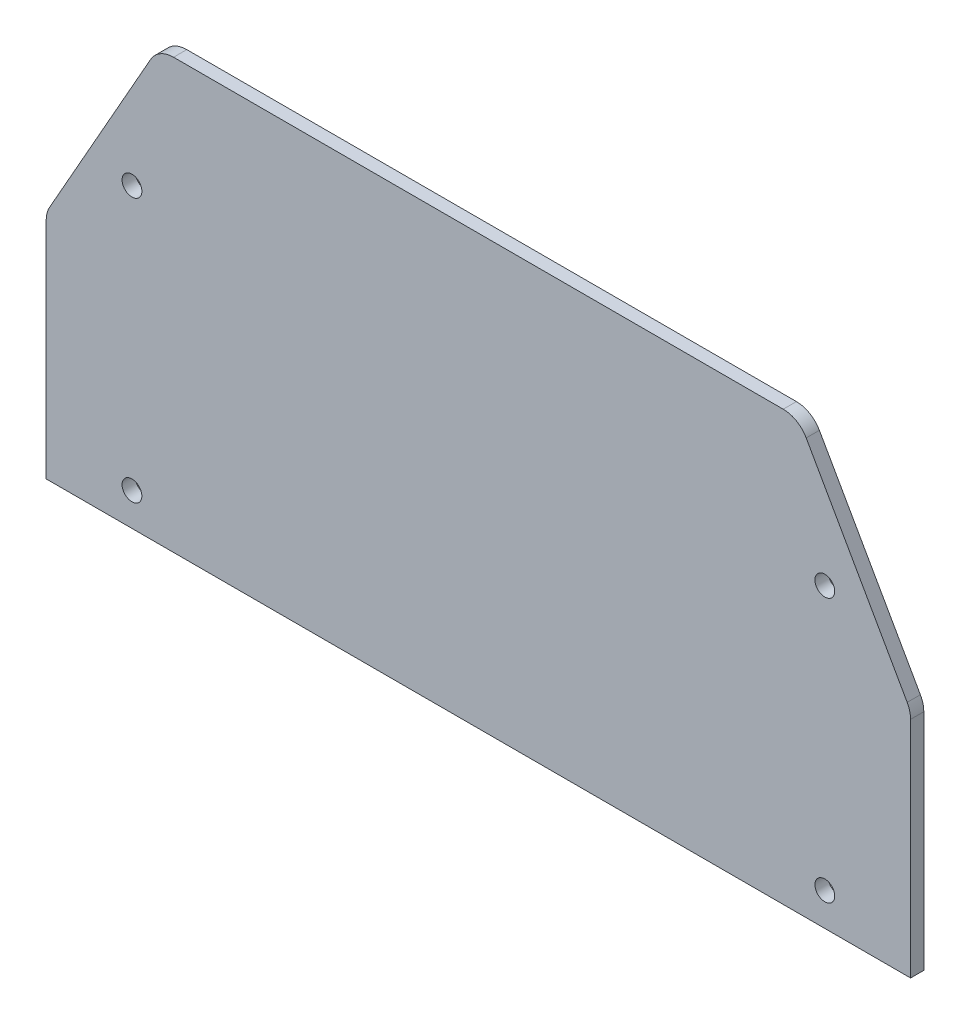
ISO-10303-21;
HEADER;
FILE_DESCRIPTION(('STEP AP214'),'2;1');
FILE_NAME('part.step','',(''),(''),'','','');
FILE_SCHEMA(('AUTOMOTIVE_DESIGN { 1 0 10303 214 1 1 1 1 }'));
ENDSEC;
DATA;
#1=APPLICATION_CONTEXT('core data for automotive mechanical design processes');
#2=APPLICATION_PROTOCOL_DEFINITION('international standard','automotive_design',2000,#1);
#3=PRODUCT_CONTEXT('',#1,'mechanical');
#4=PRODUCT('Part','Part','',(#3));
#5=PRODUCT_RELATED_PRODUCT_CATEGORY('part','',(#4));
#6=PRODUCT_DEFINITION_FORMATION('','',#4);
#7=PRODUCT_DEFINITION_CONTEXT('part definition',#1,'design');
#8=PRODUCT_DEFINITION('design','',#6,#7);
#9=PRODUCT_DEFINITION_SHAPE('','',#8);
#10=(LENGTH_UNIT() NAMED_UNIT(*) SI_UNIT(.MILLI.,.METRE.));
#11=(NAMED_UNIT(*) PLANE_ANGLE_UNIT() SI_UNIT($,.RADIAN.));
#12=(NAMED_UNIT(*) SI_UNIT($,.STERADIAN.) SOLID_ANGLE_UNIT());
#13=UNCERTAINTY_MEASURE_WITH_UNIT(LENGTH_MEASURE(1.E-05),#10,'distance_accuracy_value','');
#14=(GEOMETRIC_REPRESENTATION_CONTEXT(3) GLOBAL_UNCERTAINTY_ASSIGNED_CONTEXT((#13)) GLOBAL_UNIT_ASSIGNED_CONTEXT((#10,
#11,#12)) REPRESENTATION_CONTEXT('',''));
#15=CARTESIAN_POINT('',(0.,0.,0.));
#16=DIRECTION('',(0.,0.,1.));
#17=DIRECTION('',(1.,0.,0.));
#18=AXIS2_PLACEMENT_3D('',#15,#16,#17);
#19=CARTESIAN_POINT('',(-65.5,0.,-2.));
#20=DIRECTION('',(0.,-1.,0.));
#21=DIRECTION('',(1.,0.,0.));
#22=AXIS2_PLACEMENT_3D('',#19,#20,#21);
#23=PLANE('',#22);
#24=DIRECTION('',(1.,0.,0.));
#25=VECTOR('',#24,1.);
#26=CARTESIAN_POINT('',(-65.5,0.,0.));
#27=LINE('',#26,#25);
#28=CARTESIAN_POINT('',(-65.5,0.,0.));
#29=VERTEX_POINT('',#28);
#30=CARTESIAN_POINT('',(65.5,0.,0.));
#31=VERTEX_POINT('',#30);
#32=EDGE_CURVE('E159',#29,#31,#27,.T.);
#33=ORIENTED_EDGE('',*,*,#32,.F.);
#34=DIRECTION('',(0.,0.,1.));
#35=VECTOR('',#34,1.);
#36=CARTESIAN_POINT('',(-65.5,0.,-2.));
#37=LINE('',#36,#35);
#38=CARTESIAN_POINT('',(-65.5,0.,-2.));
#39=VERTEX_POINT('',#38);
#40=EDGE_CURVE('E129',#39,#29,#37,.T.);
#41=ORIENTED_EDGE('',*,*,#40,.F.);
#42=DIRECTION('',(1.,0.,0.));
#43=VECTOR('',#42,1.);
#44=CARTESIAN_POINT('',(-65.5,0.,-2.));
#45=LINE('',#44,#43);
#46=CARTESIAN_POINT('',(65.5,0.,-2.));
#47=VERTEX_POINT('',#46);
#48=EDGE_CURVE('E136',#39,#47,#45,.T.);
#49=ORIENTED_EDGE('',*,*,#48,.T.);
#50=DIRECTION('',(0.,0.,1.));
#51=VECTOR('',#50,1.);
#52=CARTESIAN_POINT('',(65.5,0.,-2.));
#53=LINE('',#52,#51);
#54=EDGE_CURVE('E117',#47,#31,#53,.T.);
#55=ORIENTED_EDGE('',*,*,#54,.T.);
#56=EDGE_LOOP('',(#33,#41,#49,#55));
#57=FACE_BOUND('',#56,.T.);
#58=ADVANCED_FACE('F39',(#57),#23,.T.);
#59=CARTESIAN_POINT('',(-65.5,35.,-2.));
#60=DIRECTION('',(-1.,0.,0.));
#61=DIRECTION('',(0.,-1.,0.));
#62=AXIS2_PLACEMENT_3D('',#59,#60,#61);
#63=PLANE('',#62);
#64=DIRECTION('',(0.,-1.,0.));
#65=VECTOR('',#64,1.);
#66=CARTESIAN_POINT('',(-65.5,35.,0.));
#67=LINE('',#66,#65);
#68=CARTESIAN_POINT('',(-65.5,33.9468878862509,0.));
#69=VERTEX_POINT('',#68);
#70=EDGE_CURVE('E143',#69,#29,#67,.T.);
#71=ORIENTED_EDGE('',*,*,#70,.F.);
#72=DIRECTION('',(0.,0.,1.));
#73=VECTOR('',#72,1.);
#74=CARTESIAN_POINT('',(-65.5,33.9468878862509,-2.));
#75=LINE('',#74,#73);
#76=CARTESIAN_POINT('',(-65.5,33.9468878862509,-2.));
#77=VERTEX_POINT('',#76);
#78=EDGE_CURVE('E11',#69,#77,#75,.F.);
#79=ORIENTED_EDGE('',*,*,#78,.T.);
#80=DIRECTION('',(0.,-1.,0.));
#81=VECTOR('',#80,1.);
#82=CARTESIAN_POINT('',(-65.5,35.,-2.));
#83=LINE('',#82,#81);
#84=EDGE_CURVE('E130',#77,#39,#83,.T.);
#85=ORIENTED_EDGE('',*,*,#84,.T.);
#86=ORIENTED_EDGE('',*,*,#40,.T.);
#87=EDGE_LOOP('',(#71,#79,#85,#86));
#88=FACE_BOUND('',#87,.T.);
#89=ADVANCED_FACE('F224',(#88),#63,.T.);
#90=CARTESIAN_POINT('',(-48.5268166543668,65.,-2.));
#91=DIRECTION('',(-0.870355695939899,0.492423560103468,0.));
#92=DIRECTION('',(-0.492423560103468,-0.870355695939899,0.));
#93=AXIS2_PLACEMENT_3D('',#90,#91,#92);
#94=PLANE('',#93);
#95=DIRECTION('',(-0.492423560103468,-0.870355695939899,0.));
#96=VECTOR('',#95,1.);
#97=CARTESIAN_POINT('',(-48.5268166543668,65.,0.));
#98=LINE('',#97,#96);
#99=CARTESIAN_POINT('',(-49.6755083845385,62.9696942404139,0.));
#100=VERTEX_POINT('',#99);
#101=CARTESIAN_POINT('',(-64.9814227837596,35.9165821266648,0.));
#102=VERTEX_POINT('',#101);
#103=EDGE_CURVE('E145',#100,#102,#98,.T.);
#104=ORIENTED_EDGE('',*,*,#103,.F.);
#105=DIRECTION('',(0.,0.,1.));
#106=VECTOR('',#105,1.);
#107=CARTESIAN_POINT('',(-49.6755083845385,62.9696942404139,-2.));
#108=LINE('',#107,#106);
#109=CARTESIAN_POINT('',(-49.6755083845385,62.9696942404139,-2.));
#110=VERTEX_POINT('',#109);
#111=EDGE_CURVE('E47',#100,#110,#108,.F.);
#112=ORIENTED_EDGE('',*,*,#111,.T.);
#113=DIRECTION('',(-0.492423560103468,-0.870355695939899,0.));
#114=VECTOR('',#113,1.);
#115=CARTESIAN_POINT('',(-48.5268166543668,65.,-2.));
#116=LINE('',#115,#114);
#117=CARTESIAN_POINT('',(-64.9814227837596,35.9165821266648,-2.));
#118=VERTEX_POINT('',#117);
#119=EDGE_CURVE('E155',#110,#118,#116,.T.);
#120=ORIENTED_EDGE('',*,*,#119,.T.);
#121=DIRECTION('',(0.,0.,1.));
#122=VECTOR('',#121,1.);
#123=CARTESIAN_POINT('',(-64.9814227837596,35.9165821266648,-2.));
#124=LINE('',#123,#122);
#125=EDGE_CURVE('E197',#118,#102,#124,.T.);
#126=ORIENTED_EDGE('',*,*,#125,.T.);
#127=EDGE_LOOP('',(#104,#112,#120,#126));
#128=FACE_BOUND('',#127,.T.);
#129=ADVANCED_FACE('F202',(#128),#94,.T.);
#130=CARTESIAN_POINT('',(-48.5268166543668,65.,-2.));
#131=DIRECTION('',(0.,1.,0.));
#132=DIRECTION('',(-1.,0.,0.));
#133=AXIS2_PLACEMENT_3D('',#130,#131,#132);
#134=PLANE('',#133);
#135=DIRECTION('',(-1.,0.,0.));
#136=VECTOR('',#135,1.);
#137=CARTESIAN_POINT('',(-48.5268166543668,65.,0.));
#138=LINE('',#137,#136);
#139=CARTESIAN_POINT('',(46.1940856007789,65.,0.));
#140=VERTEX_POINT('',#139);
#141=CARTESIAN_POINT('',(-46.1940856007789,65.,0.));
#142=VERTEX_POINT('',#141);
#143=EDGE_CURVE('E166',#140,#142,#138,.T.);
#144=ORIENTED_EDGE('',*,*,#143,.F.);
#145=DIRECTION('',(0.,0.,1.));
#146=VECTOR('',#145,1.);
#147=CARTESIAN_POINT('',(46.1940856007789,65.,-2.));
#148=LINE('',#147,#146);
#149=CARTESIAN_POINT('',(46.1940856007789,65.,-2.));
#150=VERTEX_POINT('',#149);
#151=EDGE_CURVE('E61',#140,#150,#148,.F.);
#152=ORIENTED_EDGE('',*,*,#151,.T.);
#153=DIRECTION('',(-1.,0.,0.));
#154=VECTOR('',#153,1.);
#155=CARTESIAN_POINT('',(-48.5268166543668,65.,-2.));
#156=LINE('',#155,#154);
#157=CARTESIAN_POINT('',(-46.1940856007789,65.,-2.));
#158=VERTEX_POINT('',#157);
#159=EDGE_CURVE('E153',#150,#158,#156,.T.);
#160=ORIENTED_EDGE('',*,*,#159,.T.);
#161=DIRECTION('',(0.,0.,1.));
#162=VECTOR('',#161,1.);
#163=CARTESIAN_POINT('',(-46.1940856007789,65.,-2.));
#164=LINE('',#163,#162);
#165=EDGE_CURVE('E193',#158,#142,#164,.T.);
#166=ORIENTED_EDGE('',*,*,#165,.T.);
#167=EDGE_LOOP('',(#144,#152,#160,#166));
#168=FACE_BOUND('',#167,.T.);
#169=ADVANCED_FACE('F208',(#168),#134,.T.);
#170=CARTESIAN_POINT('',(48.5268166543668,65.,-2.));
#171=DIRECTION('',(0.870355695939899,0.492423560103468,0.));
#172=DIRECTION('',(-0.492423560103468,0.870355695939899,0.));
#173=AXIS2_PLACEMENT_3D('',#170,#171,#172);
#174=PLANE('',#173);
#175=DIRECTION('',(-0.492423560103468,0.870355695939899,0.));
#176=VECTOR('',#175,1.);
#177=CARTESIAN_POINT('',(48.5268166543668,65.,0.));
#178=LINE('',#177,#176);
#179=CARTESIAN_POINT('',(64.9814227837596,35.9165821266648,0.));
#180=VERTEX_POINT('',#179);
#181=CARTESIAN_POINT('',(49.6755083845385,62.9696942404139,0.));
#182=VERTEX_POINT('',#181);
#183=EDGE_CURVE('E163',#180,#182,#178,.T.);
#184=ORIENTED_EDGE('',*,*,#183,.F.);
#185=DIRECTION('',(0.,0.,1.));
#186=VECTOR('',#185,1.);
#187=CARTESIAN_POINT('',(64.9814227837596,35.9165821266648,-2.));
#188=LINE('',#187,#186);
#189=CARTESIAN_POINT('',(64.9814227837596,35.9165821266648,-2.));
#190=VERTEX_POINT('',#189);
#191=EDGE_CURVE('E185',#180,#190,#188,.F.);
#192=ORIENTED_EDGE('',*,*,#191,.T.);
#193=DIRECTION('',(-0.492423560103468,0.870355695939899,0.));
#194=VECTOR('',#193,1.);
#195=CARTESIAN_POINT('',(48.5268166543668,65.,-2.));
#196=LINE('',#195,#194);
#197=CARTESIAN_POINT('',(49.6755083845385,62.9696942404139,-2.));
#198=VERTEX_POINT('',#197);
#199=EDGE_CURVE('E139',#190,#198,#196,.T.);
#200=ORIENTED_EDGE('',*,*,#199,.T.);
#201=DIRECTION('',(0.,0.,1.));
#202=VECTOR('',#201,1.);
#203=CARTESIAN_POINT('',(49.6755083845385,62.9696942404139,-2.));
#204=LINE('',#203,#202);
#205=EDGE_CURVE('E182',#198,#182,#204,.T.);
#206=ORIENTED_EDGE('',*,*,#205,.T.);
#207=EDGE_LOOP('',(#184,#192,#200,#206));
#208=FACE_BOUND('',#207,.T.);
#209=ADVANCED_FACE('F217',(#208),#174,.T.);
#210=CARTESIAN_POINT('',(65.5,35.,-2.));
#211=DIRECTION('',(1.,0.,0.));
#212=DIRECTION('',(0.,1.,0.));
#213=AXIS2_PLACEMENT_3D('',#210,#211,#212);
#214=PLANE('',#213);
#215=DIRECTION('',(0.,1.,0.));
#216=VECTOR('',#215,1.);
#217=CARTESIAN_POINT('',(65.5,35.,-2.));
#218=LINE('',#217,#216);
#219=CARTESIAN_POINT('',(65.5,33.946887886251,-2.));
#220=VERTEX_POINT('',#219);
#221=EDGE_CURVE('E121',#47,#220,#218,.T.);
#222=ORIENTED_EDGE('',*,*,#221,.T.);
#223=DIRECTION('',(0.,0.,1.));
#224=VECTOR('',#223,1.);
#225=CARTESIAN_POINT('',(65.5,33.946887886251,-2.));
#226=LINE('',#225,#224);
#227=CARTESIAN_POINT('',(65.5,33.946887886251,0.));
#228=VERTEX_POINT('',#227);
#229=EDGE_CURVE('E171',#220,#228,#226,.T.);
#230=ORIENTED_EDGE('',*,*,#229,.T.);
#231=DIRECTION('',(0.,1.,0.));
#232=VECTOR('',#231,1.);
#233=CARTESIAN_POINT('',(65.5,35.,0.));
#234=LINE('',#233,#232);
#235=EDGE_CURVE('E124',#31,#228,#234,.T.);
#236=ORIENTED_EDGE('',*,*,#235,.F.);
#237=ORIENTED_EDGE('',*,*,#54,.F.);
#238=EDGE_LOOP('',(#222,#230,#236,#237));
#239=FACE_BOUND('',#238,.T.);
#240=ADVANCED_FACE('F119',(#239),#214,.T.);
#241=CARTESIAN_POINT('',(0.,0.,-2.));
#242=DIRECTION('',(0.,0.,-1.));
#243=DIRECTION('',(-1.,0.,0.));
#244=AXIS2_PLACEMENT_3D('',#241,#242,#243);
#245=PLANE('',#244);
#246=CARTESIAN_POINT('',(52.5,45.,-2.));
#247=DIRECTION('',(0.,0.,1.));
#248=DIRECTION('',(-1.,0.,0.));
#249=AXIS2_PLACEMENT_3D('',#246,#247,#248);
#250=CIRCLE('',#249,1.5);
#251=CARTESIAN_POINT('',(51.,45.,-2.));
#252=VERTEX_POINT('',#251);
#253=EDGE_CURVE('E389',#252,#252,#250,.T.);
#254=ORIENTED_EDGE('',*,*,#253,.T.);
#255=EDGE_LOOP('',(#254));
#256=FACE_BOUND('',#255,.T.);
#257=CARTESIAN_POINT('',(52.5,5.00000000000001,-2.));
#258=DIRECTION('',(0.,0.,1.));
#259=DIRECTION('',(-1.,0.,0.));
#260=AXIS2_PLACEMENT_3D('',#257,#258,#259);
#261=CIRCLE('',#260,1.5);
#262=CARTESIAN_POINT('',(51.,5.00000000000001,-2.));
#263=VERTEX_POINT('',#262);
#264=EDGE_CURVE('E393',#263,#263,#261,.T.);
#265=ORIENTED_EDGE('',*,*,#264,.T.);
#266=EDGE_LOOP('',(#265));
#267=FACE_BOUND('',#266,.T.);
#268=CARTESIAN_POINT('',(-52.5,5.,-2.));
#269=DIRECTION('',(0.,0.,1.));
#270=DIRECTION('',(1.,0.,0.));
#271=AXIS2_PLACEMENT_3D('',#268,#269,#270);
#272=CIRCLE('',#271,1.5);
#273=CARTESIAN_POINT('',(-51.,5.,-2.));
#274=VERTEX_POINT('',#273);
#275=EDGE_CURVE('E397',#274,#274,#272,.T.);
#276=ORIENTED_EDGE('',*,*,#275,.T.);
#277=EDGE_LOOP('',(#276));
#278=FACE_BOUND('',#277,.T.);
#279=CARTESIAN_POINT('',(-52.5,45.,-2.));
#280=DIRECTION('',(0.,0.,1.));
#281=DIRECTION('',(1.,0.,0.));
#282=AXIS2_PLACEMENT_3D('',#279,#280,#281);
#283=CIRCLE('',#282,1.5);
#284=CARTESIAN_POINT('',(-51.,45.,-2.));
#285=VERTEX_POINT('',#284);
#286=EDGE_CURVE('E161',#285,#285,#283,.T.);
#287=ORIENTED_EDGE('',*,*,#286,.T.);
#288=EDGE_LOOP('',(#287));
#289=FACE_BOUND('',#288,.T.);
#290=ORIENTED_EDGE('',*,*,#199,.F.);
#291=CARTESIAN_POINT('',(61.5,33.9468878862509,-2.));
#292=DIRECTION('',(0.,0.,-1.));
#293=DIRECTION('',(-1.,0.,0.));
#294=AXIS2_PLACEMENT_3D('',#291,#292,#293);
#295=CIRCLE('',#294,4.);
#296=EDGE_CURVE('E138',#190,#220,#295,.T.);
#297=ORIENTED_EDGE('',*,*,#296,.T.);
#298=ORIENTED_EDGE('',*,*,#221,.F.);
#299=ORIENTED_EDGE('',*,*,#48,.F.);
#300=ORIENTED_EDGE('',*,*,#84,.F.);
#301=CARTESIAN_POINT('',(-61.5,33.9468878862509,-2.));
#302=DIRECTION('',(0.,0.,-1.));
#303=DIRECTION('',(-1.,0.,0.));
#304=AXIS2_PLACEMENT_3D('',#301,#302,#303);
#305=CIRCLE('',#304,4.);
#306=EDGE_CURVE('E187',#77,#118,#305,.T.);
#307=ORIENTED_EDGE('',*,*,#306,.T.);
#308=ORIENTED_EDGE('',*,*,#119,.F.);
#309=CARTESIAN_POINT('',(-46.1940856007789,61.,-2.));
#310=DIRECTION('',(0.,0.,-1.));
#311=DIRECTION('',(-1.,0.,0.));
#312=AXIS2_PLACEMENT_3D('',#309,#310,#311);
#313=CIRCLE('',#312,4.);
#314=EDGE_CURVE('E54',#110,#158,#313,.T.);
#315=ORIENTED_EDGE('',*,*,#314,.T.);
#316=ORIENTED_EDGE('',*,*,#159,.F.);
#317=CARTESIAN_POINT('',(46.1940856007789,61.,-2.));
#318=DIRECTION('',(0.,0.,-1.));
#319=DIRECTION('',(-1.,0.,0.));
#320=AXIS2_PLACEMENT_3D('',#317,#318,#319);
#321=CIRCLE('',#320,4.);
#322=EDGE_CURVE('E190',#150,#198,#321,.T.);
#323=ORIENTED_EDGE('',*,*,#322,.T.);
#324=EDGE_LOOP('',(#290,#297,#298,#299,#300,#307,#308,#315,#316,#323));
#325=FACE_BOUND('',#324,.T.);
#326=ADVANCED_FACE('F134',(#256,#267,#278,#289,#325),#245,.T.);
#327=CARTESIAN_POINT('',(0.,0.,0.));
#328=DIRECTION('',(0.,0.,-1.));
#329=DIRECTION('',(-1.,0.,0.));
#330=AXIS2_PLACEMENT_3D('',#327,#328,#329);
#331=PLANE('',#330);
#332=CARTESIAN_POINT('',(52.5,45.,0.));
#333=DIRECTION('',(0.,0.,1.));
#334=DIRECTION('',(-1.,0.,0.));
#335=AXIS2_PLACEMENT_3D('',#332,#333,#334);
#336=CIRCLE('',#335,1.5);
#337=CARTESIAN_POINT('',(51.,45.,0.));
#338=VERTEX_POINT('',#337);
#339=EDGE_CURVE('E410',#338,#338,#336,.T.);
#340=ORIENTED_EDGE('',*,*,#339,.F.);
#341=EDGE_LOOP('',(#340));
#342=FACE_BOUND('',#341,.T.);
#343=CARTESIAN_POINT('',(52.5,5.00000000000001,0.));
#344=DIRECTION('',(0.,0.,1.));
#345=DIRECTION('',(-1.,0.,0.));
#346=AXIS2_PLACEMENT_3D('',#343,#344,#345);
#347=CIRCLE('',#346,1.5);
#348=CARTESIAN_POINT('',(51.,5.00000000000001,0.));
#349=VERTEX_POINT('',#348);
#350=EDGE_CURVE('E406',#349,#349,#347,.T.);
#351=ORIENTED_EDGE('',*,*,#350,.F.);
#352=EDGE_LOOP('',(#351));
#353=FACE_BOUND('',#352,.T.);
#354=CARTESIAN_POINT('',(-52.5,5.,0.));
#355=DIRECTION('',(0.,0.,1.));
#356=DIRECTION('',(1.,0.,0.));
#357=AXIS2_PLACEMENT_3D('',#354,#355,#356);
#358=CIRCLE('',#357,1.5);
#359=CARTESIAN_POINT('',(-51.,5.,0.));
#360=VERTEX_POINT('',#359);
#361=EDGE_CURVE('E402',#360,#360,#358,.T.);
#362=ORIENTED_EDGE('',*,*,#361,.F.);
#363=EDGE_LOOP('',(#362));
#364=FACE_BOUND('',#363,.T.);
#365=CARTESIAN_POINT('',(-52.5,45.,0.));
#366=DIRECTION('',(0.,0.,1.));
#367=DIRECTION('',(1.,0.,0.));
#368=AXIS2_PLACEMENT_3D('',#365,#366,#367);
#369=CIRCLE('',#368,1.5);
#370=CARTESIAN_POINT('',(-51.,45.,0.));
#371=VERTEX_POINT('',#370);
#372=EDGE_CURVE('E148',#371,#371,#369,.T.);
#373=ORIENTED_EDGE('',*,*,#372,.F.);
#374=EDGE_LOOP('',(#373));
#375=FACE_BOUND('',#374,.T.);
#376=ORIENTED_EDGE('',*,*,#235,.T.);
#377=CARTESIAN_POINT('',(61.5,33.9468878862509,0.));
#378=DIRECTION('',(0.,0.,-1.));
#379=DIRECTION('',(-1.,0.,0.));
#380=AXIS2_PLACEMENT_3D('',#377,#378,#379);
#381=CIRCLE('',#380,4.);
#382=EDGE_CURVE('E180',#228,#180,#381,.F.);
#383=ORIENTED_EDGE('',*,*,#382,.T.);
#384=ORIENTED_EDGE('',*,*,#183,.T.);
#385=CARTESIAN_POINT('',(46.1940856007789,61.,0.));
#386=DIRECTION('',(0.,0.,-1.));
#387=DIRECTION('',(-1.,0.,0.));
#388=AXIS2_PLACEMENT_3D('',#385,#386,#387);
#389=CIRCLE('',#388,4.);
#390=EDGE_CURVE('E178',#182,#140,#389,.F.);
#391=ORIENTED_EDGE('',*,*,#390,.T.);
#392=ORIENTED_EDGE('',*,*,#143,.T.);
#393=CARTESIAN_POINT('',(-46.1940856007789,61.,0.));
#394=DIRECTION('',(0.,0.,-1.));
#395=DIRECTION('',(-1.,0.,0.));
#396=AXIS2_PLACEMENT_3D('',#393,#394,#395);
#397=CIRCLE('',#396,4.);
#398=EDGE_CURVE('E176',#142,#100,#397,.F.);
#399=ORIENTED_EDGE('',*,*,#398,.T.);
#400=ORIENTED_EDGE('',*,*,#103,.T.);
#401=CARTESIAN_POINT('',(-61.5,33.9468878862509,0.));
#402=DIRECTION('',(0.,0.,-1.));
#403=DIRECTION('',(-1.,0.,0.));
#404=AXIS2_PLACEMENT_3D('',#401,#402,#403);
#405=CIRCLE('',#404,4.);
#406=EDGE_CURVE('E174',#102,#69,#405,.F.);
#407=ORIENTED_EDGE('',*,*,#406,.T.);
#408=ORIENTED_EDGE('',*,*,#70,.T.);
#409=ORIENTED_EDGE('',*,*,#32,.T.);
#410=EDGE_LOOP('',(#376,#383,#384,#391,#392,#399,#400,#407,#408,#409));
#411=FACE_BOUND('',#410,.T.);
#412=ADVANCED_FACE('F210',(#342,#353,#364,#375,#411),#331,.F.);
#413=CARTESIAN_POINT('',(-52.5,45.,-2.));
#414=DIRECTION('',(0.,0.,1.));
#415=DIRECTION('',(1.,0.,0.));
#416=AXIS2_PLACEMENT_3D('',#413,#414,#415);
#417=CYLINDRICAL_SURFACE('',#416,1.5);
#418=ORIENTED_EDGE('',*,*,#286,.F.);
#419=EDGE_LOOP('',(#418));
#420=FACE_BOUND('',#419,.T.);
#421=ORIENTED_EDGE('',*,*,#372,.T.);
#422=EDGE_LOOP('',(#421));
#423=FACE_BOUND('',#422,.T.);
#424=ADVANCED_FACE('F296',(#420,#423),#417,.F.);
#425=CARTESIAN_POINT('',(-52.5,5.,-2.));
#426=DIRECTION('',(0.,0.,1.));
#427=DIRECTION('',(1.,0.,0.));
#428=AXIS2_PLACEMENT_3D('',#425,#426,#427);
#429=CYLINDRICAL_SURFACE('',#428,1.5);
#430=ORIENTED_EDGE('',*,*,#275,.F.);
#431=EDGE_LOOP('',(#430));
#432=FACE_BOUND('',#431,.T.);
#433=ORIENTED_EDGE('',*,*,#361,.T.);
#434=EDGE_LOOP('',(#433));
#435=FACE_BOUND('',#434,.T.);
#436=ADVANCED_FACE('F285',(#432,#435),#429,.F.);
#437=CARTESIAN_POINT('',(52.5,5.00000000000001,-2.));
#438=DIRECTION('',(0.,0.,1.));
#439=DIRECTION('',(1.,0.,0.));
#440=AXIS2_PLACEMENT_3D('',#437,#438,#439);
#441=CYLINDRICAL_SURFACE('',#440,1.5);
#442=ORIENTED_EDGE('',*,*,#264,.F.);
#443=EDGE_LOOP('',(#442));
#444=FACE_BOUND('',#443,.T.);
#445=ORIENTED_EDGE('',*,*,#350,.T.);
#446=EDGE_LOOP('',(#445));
#447=FACE_BOUND('',#446,.T.);
#448=ADVANCED_FACE('F273',(#444,#447),#441,.F.);
#449=CARTESIAN_POINT('',(52.5,45.,-2.));
#450=DIRECTION('',(0.,0.,1.));
#451=DIRECTION('',(1.,0.,0.));
#452=AXIS2_PLACEMENT_3D('',#449,#450,#451);
#453=CYLINDRICAL_SURFACE('',#452,1.5);
#454=ORIENTED_EDGE('',*,*,#253,.F.);
#455=EDGE_LOOP('',(#454));
#456=FACE_BOUND('',#455,.T.);
#457=ORIENTED_EDGE('',*,*,#339,.T.);
#458=EDGE_LOOP('',(#457));
#459=FACE_BOUND('',#458,.T.);
#460=ADVANCED_FACE('F241',(#456,#459),#453,.F.);
#461=CARTESIAN_POINT('',(61.5,33.9468878862509,-2.));
#462=DIRECTION('',(0.,0.,1.));
#463=DIRECTION('',(1.,0.,0.));
#464=AXIS2_PLACEMENT_3D('',#461,#462,#463);
#465=CYLINDRICAL_SURFACE('',#464,4.);
#466=ORIENTED_EDGE('',*,*,#296,.F.);
#467=ORIENTED_EDGE('',*,*,#191,.F.);
#468=ORIENTED_EDGE('',*,*,#382,.F.);
#469=ORIENTED_EDGE('',*,*,#229,.F.);
#470=EDGE_LOOP('',(#466,#467,#468,#469));
#471=FACE_BOUND('',#470,.T.);
#472=ADVANCED_FACE('F220',(#471),#465,.T.);
#473=CARTESIAN_POINT('',(46.1940856007789,61.,-2.));
#474=DIRECTION('',(0.,0.,1.));
#475=DIRECTION('',(1.,0.,0.));
#476=AXIS2_PLACEMENT_3D('',#473,#474,#475);
#477=CYLINDRICAL_SURFACE('',#476,4.);
#478=ORIENTED_EDGE('',*,*,#322,.F.);
#479=ORIENTED_EDGE('',*,*,#151,.F.);
#480=ORIENTED_EDGE('',*,*,#390,.F.);
#481=ORIENTED_EDGE('',*,*,#205,.F.);
#482=EDGE_LOOP('',(#478,#479,#480,#481));
#483=FACE_BOUND('',#482,.T.);
#484=ADVANCED_FACE('F215',(#483),#477,.T.);
#485=CARTESIAN_POINT('',(-46.1940856007789,61.,-2.));
#486=DIRECTION('',(0.,0.,1.));
#487=DIRECTION('',(1.,0.,0.));
#488=AXIS2_PLACEMENT_3D('',#485,#486,#487);
#489=CYLINDRICAL_SURFACE('',#488,4.);
#490=ORIENTED_EDGE('',*,*,#314,.F.);
#491=ORIENTED_EDGE('',*,*,#111,.F.);
#492=ORIENTED_EDGE('',*,*,#398,.F.);
#493=ORIENTED_EDGE('',*,*,#165,.F.);
#494=EDGE_LOOP('',(#490,#491,#492,#493));
#495=FACE_BOUND('',#494,.T.);
#496=ADVANCED_FACE('F207',(#495),#489,.T.);
#497=CARTESIAN_POINT('',(-61.5,33.9468878862509,-2.));
#498=DIRECTION('',(0.,0.,1.));
#499=DIRECTION('',(1.,0.,0.));
#500=AXIS2_PLACEMENT_3D('',#497,#498,#499);
#501=CYLINDRICAL_SURFACE('',#500,4.);
#502=ORIENTED_EDGE('',*,*,#306,.F.);
#503=ORIENTED_EDGE('',*,*,#78,.F.);
#504=ORIENTED_EDGE('',*,*,#406,.F.);
#505=ORIENTED_EDGE('',*,*,#125,.F.);
#506=EDGE_LOOP('',(#502,#503,#504,#505));
#507=FACE_BOUND('',#506,.T.);
#508=ADVANCED_FACE('F41',(#507),#501,.T.);
#509=CLOSED_SHELL('',(#58,#89,#129,#169,#209,#240,#326,#412,#424,#436,#448,#460,#472,#484,#496,#508));
#510=MANIFOLD_SOLID_BREP('B2',#509);
#511=ADVANCED_BREP_SHAPE_REPRESENTATION('',(#18,#510),#14);
#512=SHAPE_DEFINITION_REPRESENTATION(#9,#511);
ENDSEC;
END-ISO-10303-21;
